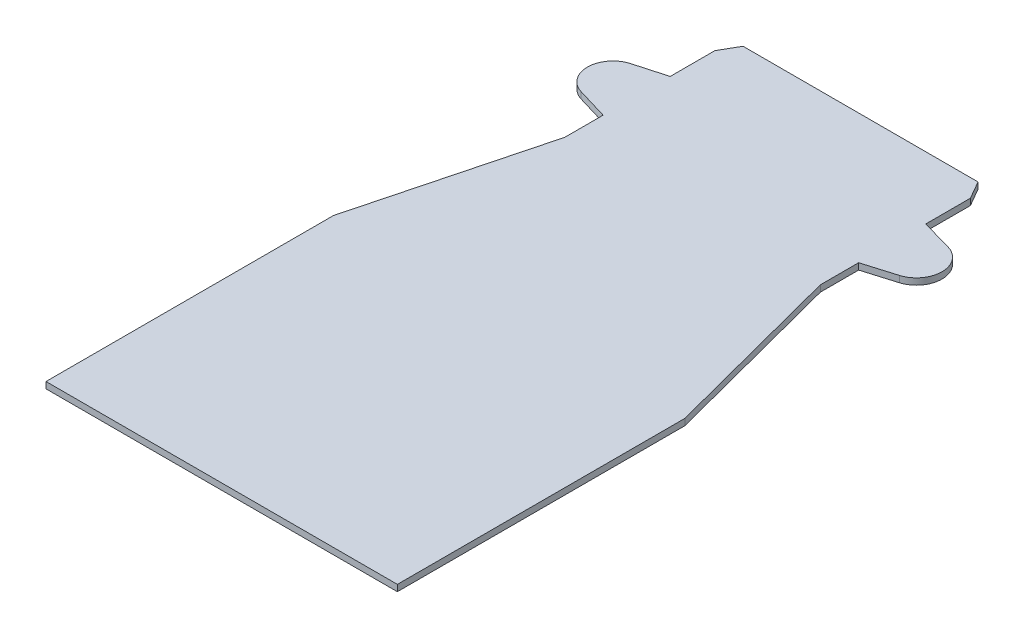
ISO-10303-21;
HEADER;
FILE_DESCRIPTION(('STEP AP214'),'2;1');
FILE_NAME('part.step','',(''),(''),'','','');
FILE_SCHEMA(('AUTOMOTIVE_DESIGN { 1 0 10303 214 1 1 1 1 }'));
ENDSEC;
DATA;
#1=APPLICATION_CONTEXT('core data for automotive mechanical design processes');
#2=APPLICATION_PROTOCOL_DEFINITION('international standard','automotive_design',2000,#1);
#3=PRODUCT_CONTEXT('',#1,'mechanical');
#4=PRODUCT('Part','Part','',(#3));
#5=PRODUCT_RELATED_PRODUCT_CATEGORY('part','',(#4));
#6=PRODUCT_DEFINITION_FORMATION('','',#4);
#7=PRODUCT_DEFINITION_CONTEXT('part definition',#1,'design');
#8=PRODUCT_DEFINITION('design','',#6,#7);
#9=PRODUCT_DEFINITION_SHAPE('','',#8);
#10=(LENGTH_UNIT() NAMED_UNIT(*) SI_UNIT(.MILLI.,.METRE.));
#11=(NAMED_UNIT(*) PLANE_ANGLE_UNIT() SI_UNIT($,.RADIAN.));
#12=(NAMED_UNIT(*) SI_UNIT($,.STERADIAN.) SOLID_ANGLE_UNIT());
#13=UNCERTAINTY_MEASURE_WITH_UNIT(LENGTH_MEASURE(1.E-05),#10,'distance_accuracy_value','');
#14=(GEOMETRIC_REPRESENTATION_CONTEXT(3) GLOBAL_UNCERTAINTY_ASSIGNED_CONTEXT((#13)) GLOBAL_UNIT_ASSIGNED_CONTEXT((#10,
#11,#12)) REPRESENTATION_CONTEXT('',''));
#15=CARTESIAN_POINT('',(0.,0.,0.));
#16=DIRECTION('',(0.,0.,1.));
#17=DIRECTION('',(1.,0.,0.));
#18=AXIS2_PLACEMENT_3D('',#15,#16,#17);
#19=CARTESIAN_POINT('',(40.,1.,-194.41154273188));
#20=DIRECTION('',(-0.86602540378444,0.,0.499999999999998));
#21=DIRECTION('',(0.499999999999998,0.,0.86602540378444));
#22=AXIS2_PLACEMENT_3D('',#19,#20,#21);
#23=PLANE('',#22);
#24=DIRECTION('',(0.,-1.,0.));
#25=VECTOR('',#24,1.);
#26=CARTESIAN_POINT('',(36.7735026918962,1.,-200.));
#27=LINE('',#26,#25);
#28=CARTESIAN_POINT('',(36.7735026918962,1.,-200.));
#29=VERTEX_POINT('',#28);
#30=CARTESIAN_POINT('',(36.7735026918962,-1.,-200.));
#31=VERTEX_POINT('',#30);
#32=EDGE_CURVE('E54',#29,#31,#27,.T.);
#33=ORIENTED_EDGE('',*,*,#32,.F.);
#34=DIRECTION('',(-0.499999999999998,0.,-0.86602540378444));
#35=VECTOR('',#34,1.);
#36=CARTESIAN_POINT('',(40.,1.,-194.41154273188));
#37=LINE('',#36,#35);
#38=CARTESIAN_POINT('',(40.,1.,-194.41154273188));
#39=VERTEX_POINT('',#38);
#40=EDGE_CURVE('E180',#39,#29,#37,.T.);
#41=ORIENTED_EDGE('',*,*,#40,.F.);
#42=DIRECTION('',(0.,-1.,0.));
#43=VECTOR('',#42,1.);
#44=CARTESIAN_POINT('',(40.,1.,-194.41154273188));
#45=LINE('',#44,#43);
#46=CARTESIAN_POINT('',(40.,-1.,-194.41154273188));
#47=VERTEX_POINT('',#46);
#48=EDGE_CURVE('E190',#39,#47,#45,.T.);
#49=ORIENTED_EDGE('',*,*,#48,.T.);
#50=DIRECTION('',(-0.499999999999998,0.,-0.86602540378444));
#51=VECTOR('',#50,1.);
#52=CARTESIAN_POINT('',(40.,-1.,-194.41154273188));
#53=LINE('',#52,#51);
#54=EDGE_CURVE('E241',#47,#31,#53,.T.);
#55=ORIENTED_EDGE('',*,*,#54,.T.);
#56=EDGE_LOOP('',(#33,#41,#49,#55));
#57=FACE_BOUND('',#56,.T.);
#58=ADVANCED_FACE('F38',(#57),#23,.F.);
#59=CARTESIAN_POINT('',(-40.,1.,-194.41154273188));
#60=DIRECTION('',(0.86602540378444,0.,0.499999999999998));
#61=DIRECTION('',(0.499999999999998,0.,-0.86602540378444));
#62=AXIS2_PLACEMENT_3D('',#59,#60,#61);
#63=PLANE('',#62);
#64=DIRECTION('',(0.,1.,0.));
#65=VECTOR('',#64,1.);
#66=CARTESIAN_POINT('',(-36.7735026918962,1.,-200.));
#67=LINE('',#66,#65);
#68=CARTESIAN_POINT('',(-36.7735026918962,-1.,-200.));
#69=VERTEX_POINT('',#68);
#70=CARTESIAN_POINT('',(-36.7735026918962,1.,-200.));
#71=VERTEX_POINT('',#70);
#72=EDGE_CURVE('E364',#69,#71,#67,.T.);
#73=ORIENTED_EDGE('',*,*,#72,.F.);
#74=DIRECTION('',(-0.499999999999998,0.,0.86602540378444));
#75=VECTOR('',#74,1.);
#76=CARTESIAN_POINT('',(-40.,-1.,-194.41154273188));
#77=LINE('',#76,#75);
#78=CARTESIAN_POINT('',(-40.,-1.,-194.41154273188));
#79=VERTEX_POINT('',#78);
#80=EDGE_CURVE('E186',#69,#79,#77,.T.);
#81=ORIENTED_EDGE('',*,*,#80,.T.);
#82=DIRECTION('',(0.,-1.,0.));
#83=VECTOR('',#82,1.);
#84=CARTESIAN_POINT('',(-40.,1.,-194.41154273188));
#85=LINE('',#84,#83);
#86=CARTESIAN_POINT('',(-40.,1.,-194.41154273188));
#87=VERTEX_POINT('',#86);
#88=EDGE_CURVE('E183',#87,#79,#85,.T.);
#89=ORIENTED_EDGE('',*,*,#88,.F.);
#90=DIRECTION('',(-0.499999999999998,0.,0.86602540378444));
#91=VECTOR('',#90,1.);
#92=CARTESIAN_POINT('',(-40.,1.,-194.41154273188));
#93=LINE('',#92,#91);
#94=EDGE_CURVE('E168',#71,#87,#93,.T.);
#95=ORIENTED_EDGE('',*,*,#94,.F.);
#96=EDGE_LOOP('',(#73,#81,#89,#95));
#97=FACE_BOUND('',#96,.T.);
#98=ADVANCED_FACE('F184',(#97),#63,.F.);
#99=CARTESIAN_POINT('',(-47.5,1.,-170.));
#100=DIRECTION('',(0.,-1.,0.));
#101=DIRECTION('',(0.,0.,-1.));
#102=AXIS2_PLACEMENT_3D('',#99,#100,#101);
#103=PLANE('',#102);
#104=DIRECTION('',(1.,0.,0.));
#105=VECTOR('',#104,1.);
#106=CARTESIAN_POINT('',(44.8299467877174,1.,-200.));
#107=LINE('',#106,#105);
#108=EDGE_CURVE('E176',#71,#29,#107,.T.);
#109=ORIENTED_EDGE('',*,*,#108,.F.);
#110=ORIENTED_EDGE('',*,*,#94,.T.);
#111=DIRECTION('',(0.,0.,1.));
#112=VECTOR('',#111,1.);
#113=CARTESIAN_POINT('',(-40.,1.,-180.41154273188));
#114=LINE('',#113,#112);
#115=CARTESIAN_POINT('',(-40.,1.,-180.41154273188));
#116=VERTEX_POINT('',#115);
#117=EDGE_CURVE('E172',#87,#116,#114,.T.);
#118=ORIENTED_EDGE('',*,*,#117,.T.);
#119=DIRECTION('',(-0.962864052439997,0.,0.26998669692936));
#120=VECTOR('',#119,1.);
#121=CARTESIAN_POINT('',(-49.6598935754349,1.,-177.70291241952));
#122=LINE('',#121,#120);
#123=CARTESIAN_POINT('',(-49.6598935754349,1.,-177.70291241952));
#124=VERTEX_POINT('',#123);
#125=EDGE_CURVE('E62',#116,#124,#122,.T.);
#126=ORIENTED_EDGE('',*,*,#125,.T.);
#127=CARTESIAN_POINT('',(-47.5,1.,-170.));
#128=DIRECTION('',(0.,1.,0.));
#129=DIRECTION('',(0.,0.,-1.));
#130=AXIS2_PLACEMENT_3D('',#127,#128,#129);
#131=CIRCLE('',#130,7.99999999999999);
#132=CARTESIAN_POINT('',(-49.7888804894443,1.,-162.334425911581));
#133=VERTEX_POINT('',#132);
#134=EDGE_CURVE('E252',#124,#133,#131,.T.);
#135=ORIENTED_EDGE('',*,*,#134,.T.);
#136=DIRECTION('',(0.958196761052377,0.,0.286110061180543));
#137=VECTOR('',#136,1.);
#138=CARTESIAN_POINT('',(-40.,1.,-159.41154273188));
#139=LINE('',#138,#137);
#140=CARTESIAN_POINT('',(-40.,1.,-159.41154273188));
#141=VERTEX_POINT('',#140);
#142=EDGE_CURVE('E128',#133,#141,#139,.T.);
#143=ORIENTED_EDGE('',*,*,#142,.T.);
#144=DIRECTION('',(0.,0.,1.));
#145=VECTOR('',#144,1.);
#146=CARTESIAN_POINT('',(-40.,1.,-147.41154273188));
#147=LINE('',#146,#145);
#148=CARTESIAN_POINT('',(-40.,1.,-147.41154273188));
#149=VERTEX_POINT('',#148);
#150=EDGE_CURVE('E326',#141,#149,#147,.T.);
#151=ORIENTED_EDGE('',*,*,#150,.T.);
#152=DIRECTION('',(-0.25278598364674,0.,0.967522220143677));
#153=VECTOR('',#152,1.);
#154=CARTESIAN_POINT('',(-55.,1.,-90.));
#155=LINE('',#154,#153);
#156=CARTESIAN_POINT('',(-55.,1.,-90.));
#157=VERTEX_POINT('',#156);
#158=EDGE_CURVE('E322',#149,#157,#155,.T.);
#159=ORIENTED_EDGE('',*,*,#158,.T.);
#160=DIRECTION('',(0.,0.,1.));
#161=VECTOR('',#160,1.);
#162=CARTESIAN_POINT('',(-55.,1.,0.));
#163=LINE('',#162,#161);
#164=CARTESIAN_POINT('',(-55.,1.,0.));
#165=VERTEX_POINT('',#164);
#166=EDGE_CURVE('E325',#157,#165,#163,.T.);
#167=ORIENTED_EDGE('',*,*,#166,.T.);
#168=DIRECTION('',(1.,0.,0.));
#169=VECTOR('',#168,1.);
#170=CARTESIAN_POINT('',(55.,1.,0.));
#171=LINE('',#170,#169);
#172=CARTESIAN_POINT('',(55.,1.,0.));
#173=VERTEX_POINT('',#172);
#174=EDGE_CURVE('E330',#165,#173,#171,.T.);
#175=ORIENTED_EDGE('',*,*,#174,.T.);
#176=DIRECTION('',(0.,0.,-1.));
#177=VECTOR('',#176,1.);
#178=CARTESIAN_POINT('',(55.,1.,0.));
#179=LINE('',#178,#177);
#180=CARTESIAN_POINT('',(55.,1.,-90.));
#181=VERTEX_POINT('',#180);
#182=EDGE_CURVE('E337',#173,#181,#179,.T.);
#183=ORIENTED_EDGE('',*,*,#182,.T.);
#184=DIRECTION('',(-0.25278598364674,0.,-0.967522220143677));
#185=VECTOR('',#184,1.);
#186=CARTESIAN_POINT('',(55.,1.,-90.));
#187=LINE('',#186,#185);
#188=CARTESIAN_POINT('',(40.,1.,-147.41154273188));
#189=VERTEX_POINT('',#188);
#190=EDGE_CURVE('E340',#181,#189,#187,.T.);
#191=ORIENTED_EDGE('',*,*,#190,.T.);
#192=DIRECTION('',(0.,0.,-1.));
#193=VECTOR('',#192,1.);
#194=CARTESIAN_POINT('',(40.,1.,-147.41154273188));
#195=LINE('',#194,#193);
#196=CARTESIAN_POINT('',(40.,1.,-159.41154273188));
#197=VERTEX_POINT('',#196);
#198=EDGE_CURVE('E343',#189,#197,#195,.T.);
#199=ORIENTED_EDGE('',*,*,#198,.T.);
#200=DIRECTION('',(0.958196761052376,0.,-0.286110061180546));
#201=VECTOR('',#200,1.);
#202=CARTESIAN_POINT('',(40.,1.,-159.41154273188));
#203=LINE('',#202,#201);
#204=CARTESIAN_POINT('',(49.7888804894443,1.,-162.334425911581));
#205=VERTEX_POINT('',#204);
#206=EDGE_CURVE('E346',#197,#205,#203,.T.);
#207=ORIENTED_EDGE('',*,*,#206,.T.);
#208=CARTESIAN_POINT('',(47.5,1.,-170.));
#209=DIRECTION('',(0.,1.,0.));
#210=DIRECTION('',(0.,0.,1.));
#211=AXIS2_PLACEMENT_3D('',#208,#209,#210);
#212=CIRCLE('',#211,7.99999999999998);
#213=CARTESIAN_POINT('',(49.6598935754349,1.,-177.70291241952));
#214=VERTEX_POINT('',#213);
#215=EDGE_CURVE('E349',#205,#214,#212,.T.);
#216=ORIENTED_EDGE('',*,*,#215,.T.);
#217=DIRECTION('',(-0.962864052439997,0.,-0.26998669692936));
#218=VECTOR('',#217,1.);
#219=CARTESIAN_POINT('',(49.6598935754349,1.,-177.70291241952));
#220=LINE('',#219,#218);
#221=CARTESIAN_POINT('',(40.,1.,-180.41154273188));
#222=VERTEX_POINT('',#221);
#223=EDGE_CURVE('E352',#214,#222,#220,.T.);
#224=ORIENTED_EDGE('',*,*,#223,.T.);
#225=DIRECTION('',(0.,0.,-1.));
#226=VECTOR('',#225,1.);
#227=CARTESIAN_POINT('',(40.,1.,-180.41154273188));
#228=LINE('',#227,#226);
#229=EDGE_CURVE('E355',#222,#39,#228,.T.);
#230=ORIENTED_EDGE('',*,*,#229,.T.);
#231=ORIENTED_EDGE('',*,*,#40,.T.);
#232=EDGE_LOOP('',(#109,#110,#118,#126,#135,#143,#151,#159,#167,#175,#183,#191,#199,#207,#216,
#224,#230,#231));
#233=FACE_BOUND('',#232,.T.);
#234=ADVANCED_FACE('F170',(#233),#103,.F.);
#235=CARTESIAN_POINT('',(-47.5,-1.,-170.));
#236=DIRECTION('',(0.,-1.,0.));
#237=DIRECTION('',(0.,0.,-1.));
#238=AXIS2_PLACEMENT_3D('',#235,#236,#237);
#239=PLANE('',#238);
#240=ORIENTED_EDGE('',*,*,#80,.F.);
#241=DIRECTION('',(1.,0.,0.));
#242=VECTOR('',#241,1.);
#243=CARTESIAN_POINT('',(-47.5,-1.,-200.));
#244=LINE('',#243,#242);
#245=EDGE_CURVE('E11',#69,#31,#244,.T.);
#246=ORIENTED_EDGE('',*,*,#245,.T.);
#247=ORIENTED_EDGE('',*,*,#54,.F.);
#248=DIRECTION('',(0.,0.,-1.));
#249=VECTOR('',#248,1.);
#250=CARTESIAN_POINT('',(40.,-1.,-180.41154273188));
#251=LINE('',#250,#249);
#252=CARTESIAN_POINT('',(40.,-1.,-180.41154273188));
#253=VERTEX_POINT('',#252);
#254=EDGE_CURVE('E238',#253,#47,#251,.T.);
#255=ORIENTED_EDGE('',*,*,#254,.F.);
#256=DIRECTION('',(-0.962864052439997,0.,-0.26998669692936));
#257=VECTOR('',#256,1.);
#258=CARTESIAN_POINT('',(49.6598935754349,-1.,-177.70291241952));
#259=LINE('',#258,#257);
#260=CARTESIAN_POINT('',(49.6598935754349,-1.,-177.70291241952));
#261=VERTEX_POINT('',#260);
#262=EDGE_CURVE('E235',#261,#253,#259,.T.);
#263=ORIENTED_EDGE('',*,*,#262,.F.);
#264=CARTESIAN_POINT('',(47.5,-1.,-170.));
#265=DIRECTION('',(0.,1.,0.));
#266=DIRECTION('',(0.,0.,1.));
#267=AXIS2_PLACEMENT_3D('',#264,#265,#266);
#268=CIRCLE('',#267,7.99999999999998);
#269=CARTESIAN_POINT('',(49.7888804894443,-1.,-162.334425911581));
#270=VERTEX_POINT('',#269);
#271=EDGE_CURVE('E232',#270,#261,#268,.T.);
#272=ORIENTED_EDGE('',*,*,#271,.F.);
#273=DIRECTION('',(0.958196761052376,0.,-0.286110061180546));
#274=VECTOR('',#273,1.);
#275=CARTESIAN_POINT('',(40.,-1.,-159.41154273188));
#276=LINE('',#275,#274);
#277=CARTESIAN_POINT('',(40.,-1.,-159.41154273188));
#278=VERTEX_POINT('',#277);
#279=EDGE_CURVE('E229',#278,#270,#276,.T.);
#280=ORIENTED_EDGE('',*,*,#279,.F.);
#281=DIRECTION('',(0.,0.,-1.));
#282=VECTOR('',#281,1.);
#283=CARTESIAN_POINT('',(40.,-1.,-147.41154273188));
#284=LINE('',#283,#282);
#285=CARTESIAN_POINT('',(40.,-1.,-147.41154273188));
#286=VERTEX_POINT('',#285);
#287=EDGE_CURVE('E226',#286,#278,#284,.T.);
#288=ORIENTED_EDGE('',*,*,#287,.F.);
#289=DIRECTION('',(-0.25278598364674,0.,-0.967522220143677));
#290=VECTOR('',#289,1.);
#291=CARTESIAN_POINT('',(55.,-1.,-90.));
#292=LINE('',#291,#290);
#293=CARTESIAN_POINT('',(55.,-1.,-90.));
#294=VERTEX_POINT('',#293);
#295=EDGE_CURVE('E223',#294,#286,#292,.T.);
#296=ORIENTED_EDGE('',*,*,#295,.F.);
#297=DIRECTION('',(0.,0.,-1.));
#298=VECTOR('',#297,1.);
#299=CARTESIAN_POINT('',(55.,-1.,0.));
#300=LINE('',#299,#298);
#301=CARTESIAN_POINT('',(55.,-1.,0.));
#302=VERTEX_POINT('',#301);
#303=EDGE_CURVE('E220',#302,#294,#300,.T.);
#304=ORIENTED_EDGE('',*,*,#303,.F.);
#305=DIRECTION('',(1.,0.,0.));
#306=VECTOR('',#305,1.);
#307=CARTESIAN_POINT('',(55.,-1.,0.));
#308=LINE('',#307,#306);
#309=CARTESIAN_POINT('',(-55.,-1.,0.));
#310=VERTEX_POINT('',#309);
#311=EDGE_CURVE('E217',#310,#302,#308,.T.);
#312=ORIENTED_EDGE('',*,*,#311,.F.);
#313=DIRECTION('',(0.,0.,1.));
#314=VECTOR('',#313,1.);
#315=CARTESIAN_POINT('',(-55.,-1.,0.));
#316=LINE('',#315,#314);
#317=CARTESIAN_POINT('',(-55.,-1.,-90.));
#318=VERTEX_POINT('',#317);
#319=EDGE_CURVE('E214',#318,#310,#316,.T.);
#320=ORIENTED_EDGE('',*,*,#319,.F.);
#321=DIRECTION('',(-0.25278598364674,0.,0.967522220143677));
#322=VECTOR('',#321,1.);
#323=CARTESIAN_POINT('',(-55.,-1.,-90.));
#324=LINE('',#323,#322);
#325=CARTESIAN_POINT('',(-40.,-1.,-147.41154273188));
#326=VERTEX_POINT('',#325);
#327=EDGE_CURVE('E211',#326,#318,#324,.T.);
#328=ORIENTED_EDGE('',*,*,#327,.F.);
#329=DIRECTION('',(0.,0.,1.));
#330=VECTOR('',#329,1.);
#331=CARTESIAN_POINT('',(-40.,-1.,-147.41154273188));
#332=LINE('',#331,#330);
#333=CARTESIAN_POINT('',(-40.,-1.,-159.41154273188));
#334=VERTEX_POINT('',#333);
#335=EDGE_CURVE('E208',#334,#326,#332,.T.);
#336=ORIENTED_EDGE('',*,*,#335,.F.);
#337=DIRECTION('',(0.958196761052377,0.,0.286110061180543));
#338=VECTOR('',#337,1.);
#339=CARTESIAN_POINT('',(-40.,-1.,-159.41154273188));
#340=LINE('',#339,#338);
#341=CARTESIAN_POINT('',(-49.7888804894443,-1.,-162.334425911581));
#342=VERTEX_POINT('',#341);
#343=EDGE_CURVE('E205',#342,#334,#340,.T.);
#344=ORIENTED_EDGE('',*,*,#343,.F.);
#345=CARTESIAN_POINT('',(-47.5,-1.,-170.));
#346=DIRECTION('',(0.,1.,0.));
#347=DIRECTION('',(0.,0.,-1.));
#348=AXIS2_PLACEMENT_3D('',#345,#346,#347);
#349=CIRCLE('',#348,7.99999999999999);
#350=CARTESIAN_POINT('',(-49.6598935754349,-1.,-177.70291241952));
#351=VERTEX_POINT('',#350);
#352=EDGE_CURVE('E201',#351,#342,#349,.T.);
#353=ORIENTED_EDGE('',*,*,#352,.F.);
#354=DIRECTION('',(-0.962864052439997,0.,0.26998669692936));
#355=VECTOR('',#354,1.);
#356=CARTESIAN_POINT('',(-49.6598935754349,-1.,-177.70291241952));
#357=LINE('',#356,#355);
#358=CARTESIAN_POINT('',(-40.,-1.,-180.41154273188));
#359=VERTEX_POINT('',#358);
#360=EDGE_CURVE('E119',#359,#351,#357,.T.);
#361=ORIENTED_EDGE('',*,*,#360,.F.);
#362=DIRECTION('',(0.,0.,1.));
#363=VECTOR('',#362,1.);
#364=CARTESIAN_POINT('',(-40.,-1.,-180.41154273188));
#365=LINE('',#364,#363);
#366=EDGE_CURVE('E247',#79,#359,#365,.T.);
#367=ORIENTED_EDGE('',*,*,#366,.F.);
#368=EDGE_LOOP('',(#240,#246,#247,#255,#263,#272,#280,#288,#296,#304,#312,#320,#328,#336,#344,
#353,#361,#367));
#369=FACE_BOUND('',#368,.T.);
#370=ADVANCED_FACE('F310',(#369),#239,.T.);
#371=CARTESIAN_POINT('',(-47.5,1.,-170.));
#372=DIRECTION('',(0.,-1.,0.));
#373=DIRECTION('',(0.,0.,-1.));
#374=AXIS2_PLACEMENT_3D('',#371,#372,#373);
#375=CYLINDRICAL_SURFACE('',#374,7.99999999999999);
#376=ORIENTED_EDGE('',*,*,#352,.T.);
#377=DIRECTION('',(0.,-1.,0.));
#378=VECTOR('',#377,1.);
#379=CARTESIAN_POINT('',(-49.7888804894443,1.,-162.334425911581));
#380=LINE('',#379,#378);
#381=EDGE_CURVE('E47',#133,#342,#380,.T.);
#382=ORIENTED_EDGE('',*,*,#381,.F.);
#383=ORIENTED_EDGE('',*,*,#134,.F.);
#384=DIRECTION('',(0.,-1.,0.));
#385=VECTOR('',#384,1.);
#386=CARTESIAN_POINT('',(-49.6598935754349,1.,-177.70291241952));
#387=LINE('',#386,#385);
#388=EDGE_CURVE('E197',#124,#351,#387,.T.);
#389=ORIENTED_EDGE('',*,*,#388,.T.);
#390=EDGE_LOOP('',(#376,#382,#383,#389));
#391=FACE_BOUND('',#390,.T.);
#392=ADVANCED_FACE('F40',(#391),#375,.T.);
#393=CARTESIAN_POINT('',(-40.,1.,-159.41154273188));
#394=DIRECTION('',(0.286110061180543,0.,-0.958196761052377));
#395=DIRECTION('',(-0.958196761052377,0.,-0.286110061180543));
#396=AXIS2_PLACEMENT_3D('',#393,#394,#395);
#397=PLANE('',#396);
#398=ORIENTED_EDGE('',*,*,#343,.T.);
#399=DIRECTION('',(0.,-1.,0.));
#400=VECTOR('',#399,1.);
#401=CARTESIAN_POINT('',(-40.,1.,-159.41154273188));
#402=LINE('',#401,#400);
#403=EDGE_CURVE('E300',#141,#334,#402,.T.);
#404=ORIENTED_EDGE('',*,*,#403,.F.);
#405=ORIENTED_EDGE('',*,*,#142,.F.);
#406=ORIENTED_EDGE('',*,*,#381,.T.);
#407=EDGE_LOOP('',(#398,#404,#405,#406));
#408=FACE_BOUND('',#407,.T.);
#409=ADVANCED_FACE('F305',(#408),#397,.F.);
#410=CARTESIAN_POINT('',(-40.,1.,-147.41154273188));
#411=DIRECTION('',(1.,0.,0.));
#412=DIRECTION('',(0.,0.,-1.));
#413=AXIS2_PLACEMENT_3D('',#410,#411,#412);
#414=PLANE('',#413);
#415=ORIENTED_EDGE('',*,*,#335,.T.);
#416=DIRECTION('',(0.,-1.,0.));
#417=VECTOR('',#416,1.);
#418=CARTESIAN_POINT('',(-40.,1.,-147.41154273188));
#419=LINE('',#418,#417);
#420=EDGE_CURVE('E296',#149,#326,#419,.T.);
#421=ORIENTED_EDGE('',*,*,#420,.F.);
#422=ORIENTED_EDGE('',*,*,#150,.F.);
#423=ORIENTED_EDGE('',*,*,#403,.T.);
#424=EDGE_LOOP('',(#415,#421,#422,#423));
#425=FACE_BOUND('',#424,.T.);
#426=ADVANCED_FACE('F316',(#425),#414,.F.);
#427=CARTESIAN_POINT('',(-55.,1.,-90.));
#428=DIRECTION('',(0.967522220143677,0.,0.25278598364674));
#429=DIRECTION('',(0.25278598364674,0.,-0.967522220143677));
#430=AXIS2_PLACEMENT_3D('',#427,#428,#429);
#431=PLANE('',#430);
#432=ORIENTED_EDGE('',*,*,#327,.T.);
#433=DIRECTION('',(0.,-1.,0.));
#434=VECTOR('',#433,1.);
#435=CARTESIAN_POINT('',(-55.,1.,-90.));
#436=LINE('',#435,#434);
#437=EDGE_CURVE('E292',#157,#318,#436,.T.);
#438=ORIENTED_EDGE('',*,*,#437,.F.);
#439=ORIENTED_EDGE('',*,*,#158,.F.);
#440=ORIENTED_EDGE('',*,*,#420,.T.);
#441=EDGE_LOOP('',(#432,#438,#439,#440));
#442=FACE_BOUND('',#441,.T.);
#443=ADVANCED_FACE('F320',(#442),#431,.F.);
#444=CARTESIAN_POINT('',(-55.,1.,0.));
#445=DIRECTION('',(1.,0.,0.));
#446=DIRECTION('',(0.,0.,-1.));
#447=AXIS2_PLACEMENT_3D('',#444,#445,#446);
#448=PLANE('',#447);
#449=ORIENTED_EDGE('',*,*,#319,.T.);
#450=DIRECTION('',(0.,-1.,0.));
#451=VECTOR('',#450,1.);
#452=CARTESIAN_POINT('',(-55.,1.,0.));
#453=LINE('',#452,#451);
#454=EDGE_CURVE('E288',#165,#310,#453,.T.);
#455=ORIENTED_EDGE('',*,*,#454,.F.);
#456=ORIENTED_EDGE('',*,*,#166,.F.);
#457=ORIENTED_EDGE('',*,*,#437,.T.);
#458=EDGE_LOOP('',(#449,#455,#456,#457));
#459=FACE_BOUND('',#458,.T.);
#460=ADVANCED_FACE('F426',(#459),#448,.F.);
#461=CARTESIAN_POINT('',(55.,1.,0.));
#462=DIRECTION('',(0.,0.,-1.));
#463=DIRECTION('',(-1.,0.,0.));
#464=AXIS2_PLACEMENT_3D('',#461,#462,#463);
#465=PLANE('',#464);
#466=ORIENTED_EDGE('',*,*,#311,.T.);
#467=DIRECTION('',(0.,-1.,0.));
#468=VECTOR('',#467,1.);
#469=CARTESIAN_POINT('',(55.,1.,0.));
#470=LINE('',#469,#468);
#471=EDGE_CURVE('E284',#173,#302,#470,.T.);
#472=ORIENTED_EDGE('',*,*,#471,.F.);
#473=ORIENTED_EDGE('',*,*,#174,.F.);
#474=ORIENTED_EDGE('',*,*,#454,.T.);
#475=EDGE_LOOP('',(#466,#472,#473,#474));
#476=FACE_BOUND('',#475,.T.);
#477=ADVANCED_FACE('F422',(#476),#465,.F.);
#478=CARTESIAN_POINT('',(55.,1.,0.));
#479=DIRECTION('',(-1.,0.,0.));
#480=DIRECTION('',(0.,0.,1.));
#481=AXIS2_PLACEMENT_3D('',#478,#479,#480);
#482=PLANE('',#481);
#483=ORIENTED_EDGE('',*,*,#303,.T.);
#484=DIRECTION('',(0.,-1.,0.));
#485=VECTOR('',#484,1.);
#486=CARTESIAN_POINT('',(55.,1.,-90.));
#487=LINE('',#486,#485);
#488=EDGE_CURVE('E280',#181,#294,#487,.T.);
#489=ORIENTED_EDGE('',*,*,#488,.F.);
#490=ORIENTED_EDGE('',*,*,#182,.F.);
#491=ORIENTED_EDGE('',*,*,#471,.T.);
#492=EDGE_LOOP('',(#483,#489,#490,#491));
#493=FACE_BOUND('',#492,.T.);
#494=ADVANCED_FACE('F418',(#493),#482,.F.);
#495=CARTESIAN_POINT('',(55.,1.,-90.));
#496=DIRECTION('',(-0.967522220143677,0.,0.25278598364674));
#497=DIRECTION('',(0.25278598364674,0.,0.967522220143677));
#498=AXIS2_PLACEMENT_3D('',#495,#496,#497);
#499=PLANE('',#498);
#500=ORIENTED_EDGE('',*,*,#295,.T.);
#501=DIRECTION('',(0.,-1.,0.));
#502=VECTOR('',#501,1.);
#503=CARTESIAN_POINT('',(40.,1.,-147.41154273188));
#504=LINE('',#503,#502);
#505=EDGE_CURVE('E276',#189,#286,#504,.T.);
#506=ORIENTED_EDGE('',*,*,#505,.F.);
#507=ORIENTED_EDGE('',*,*,#190,.F.);
#508=ORIENTED_EDGE('',*,*,#488,.T.);
#509=EDGE_LOOP('',(#500,#506,#507,#508));
#510=FACE_BOUND('',#509,.T.);
#511=ADVANCED_FACE('F414',(#510),#499,.F.);
#512=CARTESIAN_POINT('',(40.,1.,-147.41154273188));
#513=DIRECTION('',(-1.,0.,0.));
#514=DIRECTION('',(0.,0.,1.));
#515=AXIS2_PLACEMENT_3D('',#512,#513,#514);
#516=PLANE('',#515);
#517=ORIENTED_EDGE('',*,*,#287,.T.);
#518=DIRECTION('',(0.,-1.,0.));
#519=VECTOR('',#518,1.);
#520=CARTESIAN_POINT('',(40.,1.,-159.41154273188));
#521=LINE('',#520,#519);
#522=EDGE_CURVE('E272',#197,#278,#521,.T.);
#523=ORIENTED_EDGE('',*,*,#522,.F.);
#524=ORIENTED_EDGE('',*,*,#198,.F.);
#525=ORIENTED_EDGE('',*,*,#505,.T.);
#526=EDGE_LOOP('',(#517,#523,#524,#525));
#527=FACE_BOUND('',#526,.T.);
#528=ADVANCED_FACE('F410',(#527),#516,.F.);
#529=CARTESIAN_POINT('',(40.,1.,-159.41154273188));
#530=DIRECTION('',(-0.286110061180546,0.,-0.958196761052376));
#531=DIRECTION('',(-0.958196761052376,0.,0.286110061180546));
#532=AXIS2_PLACEMENT_3D('',#529,#530,#531);
#533=PLANE('',#532);
#534=ORIENTED_EDGE('',*,*,#279,.T.);
#535=DIRECTION('',(0.,-1.,0.));
#536=VECTOR('',#535,1.);
#537=CARTESIAN_POINT('',(49.7888804894443,1.,-162.334425911581));
#538=LINE('',#537,#536);
#539=EDGE_CURVE('E268',#205,#270,#538,.T.);
#540=ORIENTED_EDGE('',*,*,#539,.F.);
#541=ORIENTED_EDGE('',*,*,#206,.F.);
#542=ORIENTED_EDGE('',*,*,#522,.T.);
#543=EDGE_LOOP('',(#534,#540,#541,#542));
#544=FACE_BOUND('',#543,.T.);
#545=ADVANCED_FACE('F406',(#544),#533,.F.);
#546=CARTESIAN_POINT('',(47.5,1.,-170.));
#547=DIRECTION('',(0.,-1.,0.));
#548=DIRECTION('',(0.,0.,-1.));
#549=AXIS2_PLACEMENT_3D('',#546,#547,#548);
#550=CYLINDRICAL_SURFACE('',#549,7.99999999999998);
#551=ORIENTED_EDGE('',*,*,#271,.T.);
#552=DIRECTION('',(0.,-1.,0.));
#553=VECTOR('',#552,1.);
#554=CARTESIAN_POINT('',(49.6598935754349,1.,-177.70291241952));
#555=LINE('',#554,#553);
#556=EDGE_CURVE('E264',#214,#261,#555,.T.);
#557=ORIENTED_EDGE('',*,*,#556,.F.);
#558=ORIENTED_EDGE('',*,*,#215,.F.);
#559=ORIENTED_EDGE('',*,*,#539,.T.);
#560=EDGE_LOOP('',(#551,#557,#558,#559));
#561=FACE_BOUND('',#560,.T.);
#562=ADVANCED_FACE('F402',(#561),#550,.T.);
#563=CARTESIAN_POINT('',(49.6598935754349,1.,-177.70291241952));
#564=DIRECTION('',(-0.26998669692936,0.,0.962864052439997));
#565=DIRECTION('',(0.962864052439997,0.,0.26998669692936));
#566=AXIS2_PLACEMENT_3D('',#563,#564,#565);
#567=PLANE('',#566);
#568=ORIENTED_EDGE('',*,*,#262,.T.);
#569=DIRECTION('',(0.,-1.,0.));
#570=VECTOR('',#569,1.);
#571=CARTESIAN_POINT('',(40.,1.,-180.41154273188));
#572=LINE('',#571,#570);
#573=EDGE_CURVE('E260',#222,#253,#572,.T.);
#574=ORIENTED_EDGE('',*,*,#573,.F.);
#575=ORIENTED_EDGE('',*,*,#223,.F.);
#576=ORIENTED_EDGE('',*,*,#556,.T.);
#577=EDGE_LOOP('',(#568,#574,#575,#576));
#578=FACE_BOUND('',#577,.T.);
#579=ADVANCED_FACE('F398',(#578),#567,.F.);
#580=CARTESIAN_POINT('',(40.,1.,-180.41154273188));
#581=DIRECTION('',(-1.,0.,0.));
#582=DIRECTION('',(0.,0.,1.));
#583=AXIS2_PLACEMENT_3D('',#580,#581,#582);
#584=PLANE('',#583);
#585=ORIENTED_EDGE('',*,*,#254,.T.);
#586=ORIENTED_EDGE('',*,*,#48,.F.);
#587=ORIENTED_EDGE('',*,*,#229,.F.);
#588=ORIENTED_EDGE('',*,*,#573,.T.);
#589=EDGE_LOOP('',(#585,#586,#587,#588));
#590=FACE_BOUND('',#589,.T.);
#591=ADVANCED_FACE('F386',(#590),#584,.F.);
#592=CARTESIAN_POINT('',(-40.,1.,-180.41154273188));
#593=DIRECTION('',(1.,0.,0.));
#594=DIRECTION('',(0.,0.,-1.));
#595=AXIS2_PLACEMENT_3D('',#592,#593,#594);
#596=PLANE('',#595);
#597=ORIENTED_EDGE('',*,*,#366,.T.);
#598=DIRECTION('',(0.,-1.,0.));
#599=VECTOR('',#598,1.);
#600=CARTESIAN_POINT('',(-40.,1.,-180.41154273188));
#601=LINE('',#600,#599);
#602=EDGE_CURVE('E191',#116,#359,#601,.T.);
#603=ORIENTED_EDGE('',*,*,#602,.F.);
#604=ORIENTED_EDGE('',*,*,#117,.F.);
#605=ORIENTED_EDGE('',*,*,#88,.T.);
#606=EDGE_LOOP('',(#597,#603,#604,#605));
#607=FACE_BOUND('',#606,.T.);
#608=ADVANCED_FACE('F193',(#607),#596,.F.);
#609=CARTESIAN_POINT('',(-49.6598935754349,1.,-177.70291241952));
#610=DIRECTION('',(0.26998669692936,0.,0.962864052439997));
#611=DIRECTION('',(0.962864052439997,0.,-0.26998669692936));
#612=AXIS2_PLACEMENT_3D('',#609,#610,#611);
#613=PLANE('',#612);
#614=ORIENTED_EDGE('',*,*,#360,.T.);
#615=ORIENTED_EDGE('',*,*,#388,.F.);
#616=ORIENTED_EDGE('',*,*,#125,.F.);
#617=ORIENTED_EDGE('',*,*,#602,.T.);
#618=EDGE_LOOP('',(#614,#615,#616,#617));
#619=FACE_BOUND('',#618,.T.);
#620=ADVANCED_FACE('F377',(#619),#613,.F.);
#621=CARTESIAN_POINT('',(0.,0.,-200.));
#622=DIRECTION('',(0.,0.,-1.));
#623=DIRECTION('',(-1.,0.,0.));
#624=AXIS2_PLACEMENT_3D('',#621,#622,#623);
#625=PLANE('',#624);
#626=ORIENTED_EDGE('',*,*,#32,.T.);
#627=ORIENTED_EDGE('',*,*,#245,.F.);
#628=ORIENTED_EDGE('',*,*,#72,.T.);
#629=ORIENTED_EDGE('',*,*,#108,.T.);
#630=EDGE_LOOP('',(#626,#627,#628,#629));
#631=FACE_BOUND('',#630,.T.);
#632=ADVANCED_FACE('F374',(#631),#625,.T.);
#633=CLOSED_SHELL('',(#58,#98,#234,#370,#392,#409,#426,#443,#460,#477,#494,#511,#528,#545,#562,
#579,#591,#608,#620,#632));
#634=MANIFOLD_SOLID_BREP('B2',#633);
#635=ADVANCED_BREP_SHAPE_REPRESENTATION('',(#18,#634),#14);
#636=SHAPE_DEFINITION_REPRESENTATION(#9,#635);
ENDSEC;
END-ISO-10303-21;
